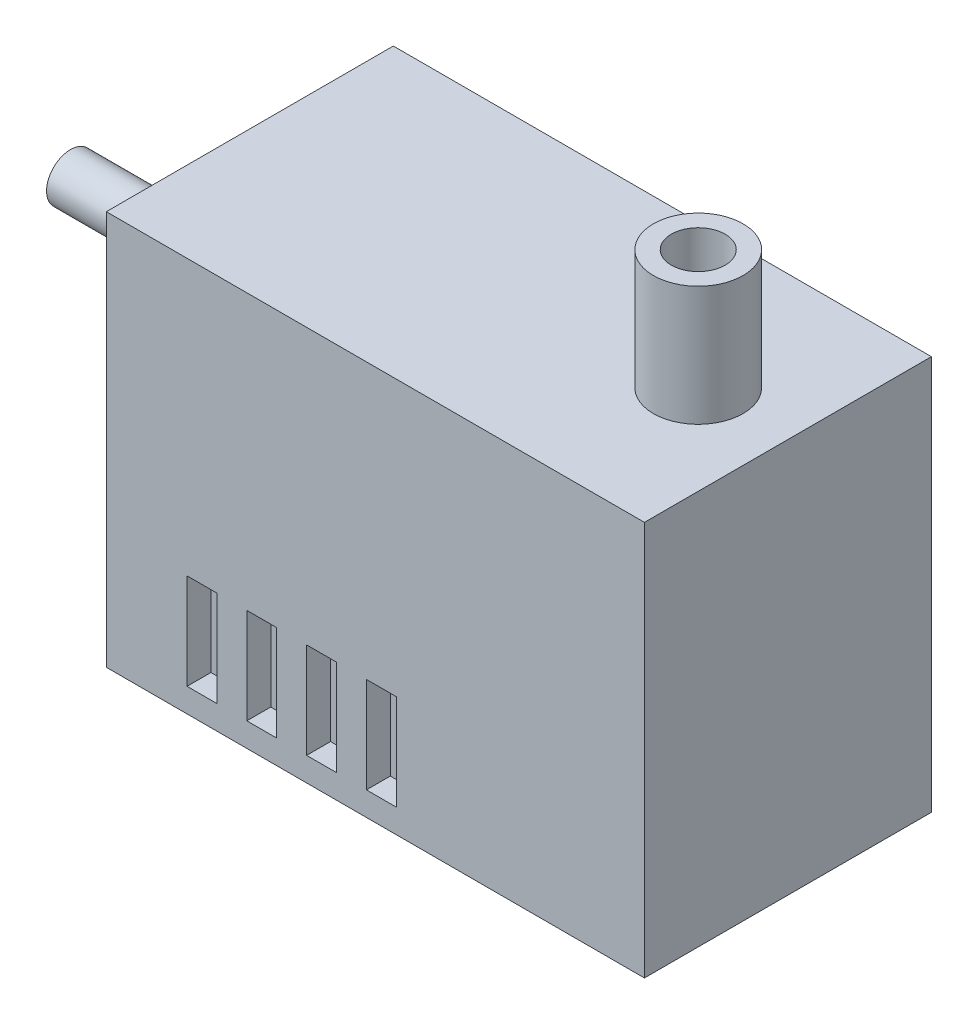
ISO-10303-21;
HEADER;
FILE_DESCRIPTION(('STEP AP214'),'2;1');
FILE_NAME('part.step','',(''),(''),'','','');
FILE_SCHEMA(('AUTOMOTIVE_DESIGN { 1 0 10303 214 1 1 1 1 }'));
ENDSEC;
DATA;
#1=APPLICATION_CONTEXT('core data for automotive mechanical design processes');
#2=APPLICATION_PROTOCOL_DEFINITION('international standard','automotive_design',2000,#1);
#3=PRODUCT_CONTEXT('',#1,'mechanical');
#4=PRODUCT('Part','Part','',(#3));
#5=PRODUCT_RELATED_PRODUCT_CATEGORY('part','',(#4));
#6=PRODUCT_DEFINITION_FORMATION('','',#4);
#7=PRODUCT_DEFINITION_CONTEXT('part definition',#1,'design');
#8=PRODUCT_DEFINITION('design','',#6,#7);
#9=PRODUCT_DEFINITION_SHAPE('','',#8);
#10=(LENGTH_UNIT() NAMED_UNIT(*) SI_UNIT(.MILLI.,.METRE.));
#11=(NAMED_UNIT(*) PLANE_ANGLE_UNIT() SI_UNIT($,.RADIAN.));
#12=(NAMED_UNIT(*) SI_UNIT($,.STERADIAN.) SOLID_ANGLE_UNIT());
#13=UNCERTAINTY_MEASURE_WITH_UNIT(LENGTH_MEASURE(1.E-05),#10,'distance_accuracy_value','');
#14=(GEOMETRIC_REPRESENTATION_CONTEXT(3) GLOBAL_UNCERTAINTY_ASSIGNED_CONTEXT((#13)) GLOBAL_UNIT_ASSIGNED_CONTEXT((#10,
#11,#12)) REPRESENTATION_CONTEXT('',''));
#15=CARTESIAN_POINT('',(0.,0.,0.));
#16=DIRECTION('',(0.,0.,1.));
#17=DIRECTION('',(1.,0.,0.));
#18=AXIS2_PLACEMENT_3D('',#15,#16,#17);
#19=CARTESIAN_POINT('',(22.5,33.,12.));
#20=DIRECTION('',(-1.,0.,0.));
#21=DIRECTION('',(0.,0.,1.));
#22=AXIS2_PLACEMENT_3D('',#19,#20,#21);
#23=PLANE('',#22);
#24=DIRECTION('',(0.,0.,-1.));
#25=VECTOR('',#24,1.);
#26=CARTESIAN_POINT('',(22.5,0.,12.));
#27=LINE('',#26,#25);
#28=CARTESIAN_POINT('',(22.5,0.,12.));
#29=VERTEX_POINT('',#28);
#30=CARTESIAN_POINT('',(22.5,0.,-12.));
#31=VERTEX_POINT('',#30);
#32=EDGE_CURVE('E321',#29,#31,#27,.T.);
#33=ORIENTED_EDGE('',*,*,#32,.T.);
#34=DIRECTION('',(0.,-1.,0.));
#35=VECTOR('',#34,1.);
#36=CARTESIAN_POINT('',(22.5,33.,-12.));
#37=LINE('',#36,#35);
#38=CARTESIAN_POINT('',(22.5,33.,-12.));
#39=VERTEX_POINT('',#38);
#40=EDGE_CURVE('E46',#39,#31,#37,.T.);
#41=ORIENTED_EDGE('',*,*,#40,.F.);
#42=DIRECTION('',(0.,0.,-1.));
#43=VECTOR('',#42,1.);
#44=CARTESIAN_POINT('',(22.5,33.,12.));
#45=LINE('',#44,#43);
#46=CARTESIAN_POINT('',(22.5,33.,12.));
#47=VERTEX_POINT('',#46);
#48=EDGE_CURVE('E327',#47,#39,#45,.T.);
#49=ORIENTED_EDGE('',*,*,#48,.F.);
#50=DIRECTION('',(0.,-1.,0.));
#51=VECTOR('',#50,1.);
#52=CARTESIAN_POINT('',(22.5,33.,12.));
#53=LINE('',#52,#51);
#54=EDGE_CURVE('E337',#47,#29,#53,.T.);
#55=ORIENTED_EDGE('',*,*,#54,.T.);
#56=EDGE_LOOP('',(#33,#41,#49,#55));
#57=FACE_BOUND('',#56,.T.);
#58=ADVANCED_FACE('F43',(#57),#23,.F.);
#59=CARTESIAN_POINT('',(-22.5,33.,-12.));
#60=DIRECTION('',(0.,0.,1.));
#61=DIRECTION('',(1.,0.,0.));
#62=AXIS2_PLACEMENT_3D('',#59,#60,#61);
#63=PLANE('',#62);
#64=DIRECTION('',(-1.,0.,0.));
#65=VECTOR('',#64,1.);
#66=CARTESIAN_POINT('',(-22.5,0.,-12.));
#67=LINE('',#66,#65);
#68=CARTESIAN_POINT('',(-22.5,0.,-12.));
#69=VERTEX_POINT('',#68);
#70=EDGE_CURVE('E339',#31,#69,#67,.T.);
#71=ORIENTED_EDGE('',*,*,#70,.T.);
#72=DIRECTION('',(0.,-1.,0.));
#73=VECTOR('',#72,1.);
#74=CARTESIAN_POINT('',(-22.5,33.,-12.));
#75=LINE('',#74,#73);
#76=CARTESIAN_POINT('',(-22.5,33.,-12.));
#77=VERTEX_POINT('',#76);
#78=EDGE_CURVE('E349',#77,#69,#75,.T.);
#79=ORIENTED_EDGE('',*,*,#78,.F.);
#80=DIRECTION('',(-1.,0.,0.));
#81=VECTOR('',#80,1.);
#82=CARTESIAN_POINT('',(-22.5,33.,-12.));
#83=LINE('',#82,#81);
#84=EDGE_CURVE('E326',#39,#77,#83,.T.);
#85=ORIENTED_EDGE('',*,*,#84,.F.);
#86=ORIENTED_EDGE('',*,*,#40,.T.);
#87=EDGE_LOOP('',(#71,#79,#85,#86));
#88=FACE_BOUND('',#87,.T.);
#89=ADVANCED_FACE('F357',(#88),#63,.F.);
#90=CARTESIAN_POINT('',(-22.5,33.,12.));
#91=DIRECTION('',(1.,0.,0.));
#92=DIRECTION('',(0.,0.,-1.));
#93=AXIS2_PLACEMENT_3D('',#90,#91,#92);
#94=PLANE('',#93);
#95=CARTESIAN_POINT('',(-22.5,22.,0.));
#96=DIRECTION('',(1.,0.,0.));
#97=DIRECTION('',(0.,0.,-1.));
#98=AXIS2_PLACEMENT_3D('',#95,#96,#97);
#99=CIRCLE('',#98,2.);
#100=CARTESIAN_POINT('',(-22.5,22.,-2.));
#101=VERTEX_POINT('',#100);
#102=EDGE_CURVE('E294',#101,#101,#99,.T.);
#103=ORIENTED_EDGE('',*,*,#102,.T.);
#104=EDGE_LOOP('',(#103));
#105=FACE_BOUND('',#104,.T.);
#106=DIRECTION('',(0.,0.,1.));
#107=VECTOR('',#106,1.);
#108=CARTESIAN_POINT('',(-22.5,0.,12.));
#109=LINE('',#108,#107);
#110=CARTESIAN_POINT('',(-22.5,0.,12.));
#111=VERTEX_POINT('',#110);
#112=EDGE_CURVE('E342',#69,#111,#109,.T.);
#113=ORIENTED_EDGE('',*,*,#112,.T.);
#114=DIRECTION('',(0.,-1.,0.));
#115=VECTOR('',#114,1.);
#116=CARTESIAN_POINT('',(-22.5,33.,12.));
#117=LINE('',#116,#115);
#118=CARTESIAN_POINT('',(-22.5,33.,12.));
#119=VERTEX_POINT('',#118);
#120=EDGE_CURVE('E347',#119,#111,#117,.T.);
#121=ORIENTED_EDGE('',*,*,#120,.F.);
#122=DIRECTION('',(0.,0.,1.));
#123=VECTOR('',#122,1.);
#124=CARTESIAN_POINT('',(-22.5,33.,12.));
#125=LINE('',#124,#123);
#126=EDGE_CURVE('E335',#77,#119,#125,.T.);
#127=ORIENTED_EDGE('',*,*,#126,.F.);
#128=ORIENTED_EDGE('',*,*,#78,.T.);
#129=EDGE_LOOP('',(#113,#121,#127,#128));
#130=FACE_BOUND('',#129,.T.);
#131=ADVANCED_FACE('F366',(#105,#130),#94,.F.);
#132=CARTESIAN_POINT('',(-22.5,33.,12.));
#133=DIRECTION('',(0.,0.,-1.));
#134=DIRECTION('',(-1.,0.,0.));
#135=AXIS2_PLACEMENT_3D('',#132,#133,#134);
#136=PLANE('',#135);
#137=DIRECTION('',(1.,0.,0.));
#138=VECTOR('',#137,1.);
#139=CARTESIAN_POINT('',(-15.75,2.,12.));
#140=LINE('',#139,#138);
#141=CARTESIAN_POINT('',(-15.75,2.,12.));
#142=VERTEX_POINT('',#141);
#143=CARTESIAN_POINT('',(-13.25,2.,12.));
#144=VERTEX_POINT('',#143);
#145=EDGE_CURVE('E215',#142,#144,#140,.T.);
#146=ORIENTED_EDGE('',*,*,#145,.F.);
#147=DIRECTION('',(0.,-1.,0.));
#148=VECTOR('',#147,1.);
#149=CARTESIAN_POINT('',(-15.75,10.,12.));
#150=LINE('',#149,#148);
#151=CARTESIAN_POINT('',(-15.75,10.,12.));
#152=VERTEX_POINT('',#151);
#153=EDGE_CURVE('E59',#152,#142,#150,.T.);
#154=ORIENTED_EDGE('',*,*,#153,.F.);
#155=DIRECTION('',(-1.,0.,0.));
#156=VECTOR('',#155,1.);
#157=CARTESIAN_POINT('',(-13.25,10.,12.));
#158=LINE('',#157,#156);
#159=CARTESIAN_POINT('',(-13.25,10.,12.));
#160=VERTEX_POINT('',#159);
#161=EDGE_CURVE('E198',#160,#152,#158,.T.);
#162=ORIENTED_EDGE('',*,*,#161,.F.);
#163=DIRECTION('',(0.,1.,0.));
#164=VECTOR('',#163,1.);
#165=CARTESIAN_POINT('',(-13.25,2.,12.));
#166=LINE('',#165,#164);
#167=EDGE_CURVE('E204',#144,#160,#166,.T.);
#168=ORIENTED_EDGE('',*,*,#167,.F.);
#169=EDGE_LOOP('',(#146,#154,#162,#168));
#170=FACE_BOUND('',#169,.T.);
#171=DIRECTION('',(1.,0.,0.));
#172=VECTOR('',#171,1.);
#173=CARTESIAN_POINT('',(-10.75,2.,12.));
#174=LINE('',#173,#172);
#175=CARTESIAN_POINT('',(-10.75,2.,12.));
#176=VERTEX_POINT('',#175);
#177=CARTESIAN_POINT('',(-8.25,2.,12.));
#178=VERTEX_POINT('',#177);
#179=EDGE_CURVE('E237',#176,#178,#174,.T.);
#180=ORIENTED_EDGE('',*,*,#179,.F.);
#181=DIRECTION('',(0.,-1.,0.));
#182=VECTOR('',#181,1.);
#183=CARTESIAN_POINT('',(-10.75,10.,12.));
#184=LINE('',#183,#182);
#185=CARTESIAN_POINT('',(-10.75,10.,12.));
#186=VERTEX_POINT('',#185);
#187=EDGE_CURVE('E67',#186,#176,#184,.T.);
#188=ORIENTED_EDGE('',*,*,#187,.F.);
#189=DIRECTION('',(-1.,0.,0.));
#190=VECTOR('',#189,1.);
#191=CARTESIAN_POINT('',(-8.25,10.,12.));
#192=LINE('',#191,#190);
#193=CARTESIAN_POINT('',(-8.25,10.,12.));
#194=VERTEX_POINT('',#193);
#195=EDGE_CURVE('E235',#194,#186,#192,.T.);
#196=ORIENTED_EDGE('',*,*,#195,.F.);
#197=DIRECTION('',(0.,1.,0.));
#198=VECTOR('',#197,1.);
#199=CARTESIAN_POINT('',(-8.25,2.,12.));
#200=LINE('',#199,#198);
#201=EDGE_CURVE('E232',#178,#194,#200,.T.);
#202=ORIENTED_EDGE('',*,*,#201,.F.);
#203=EDGE_LOOP('',(#180,#188,#196,#202));
#204=FACE_BOUND('',#203,.T.);
#205=DIRECTION('',(1.,0.,0.));
#206=VECTOR('',#205,1.);
#207=CARTESIAN_POINT('',(-5.75,2.,12.));
#208=LINE('',#207,#206);
#209=CARTESIAN_POINT('',(-5.75,2.,12.));
#210=VERTEX_POINT('',#209);
#211=CARTESIAN_POINT('',(-3.25,2.,12.));
#212=VERTEX_POINT('',#211);
#213=EDGE_CURVE('E272',#210,#212,#208,.T.);
#214=ORIENTED_EDGE('',*,*,#213,.F.);
#215=DIRECTION('',(0.,-1.,0.));
#216=VECTOR('',#215,1.);
#217=CARTESIAN_POINT('',(-5.75,10.,12.));
#218=LINE('',#217,#216);
#219=CARTESIAN_POINT('',(-5.75,10.,12.));
#220=VERTEX_POINT('',#219);
#221=EDGE_CURVE('E233',#220,#210,#218,.T.);
#222=ORIENTED_EDGE('',*,*,#221,.F.);
#223=DIRECTION('',(-1.,0.,0.));
#224=VECTOR('',#223,1.);
#225=CARTESIAN_POINT('',(-3.25,10.,12.));
#226=LINE('',#225,#224);
#227=CARTESIAN_POINT('',(-3.25,10.,12.));
#228=VERTEX_POINT('',#227);
#229=EDGE_CURVE('E261',#228,#220,#226,.T.);
#230=ORIENTED_EDGE('',*,*,#229,.F.);
#231=DIRECTION('',(0.,1.,0.));
#232=VECTOR('',#231,1.);
#233=CARTESIAN_POINT('',(-3.25,2.,12.));
#234=LINE('',#233,#232);
#235=EDGE_CURVE('E270',#212,#228,#234,.T.);
#236=ORIENTED_EDGE('',*,*,#235,.F.);
#237=EDGE_LOOP('',(#214,#222,#230,#236));
#238=FACE_BOUND('',#237,.T.);
#239=DIRECTION('',(1.,0.,0.));
#240=VECTOR('',#239,1.);
#241=CARTESIAN_POINT('',(-0.75,2.,12.));
#242=LINE('',#241,#240);
#243=CARTESIAN_POINT('',(-0.749999999999997,2.,12.));
#244=VERTEX_POINT('',#243);
#245=CARTESIAN_POINT('',(1.75,2.,12.));
#246=VERTEX_POINT('',#245);
#247=EDGE_CURVE('E303',#244,#246,#242,.T.);
#248=ORIENTED_EDGE('',*,*,#247,.F.);
#249=DIRECTION('',(0.,-1.,0.));
#250=VECTOR('',#249,1.);
#251=CARTESIAN_POINT('',(-0.75,10.,12.));
#252=LINE('',#251,#250);
#253=CARTESIAN_POINT('',(-0.75,10.,12.));
#254=VERTEX_POINT('',#253);
#255=EDGE_CURVE('E264',#254,#244,#252,.T.);
#256=ORIENTED_EDGE('',*,*,#255,.F.);
#257=DIRECTION('',(-1.,0.,0.));
#258=VECTOR('',#257,1.);
#259=CARTESIAN_POINT('',(1.75,10.,12.));
#260=LINE('',#259,#258);
#261=CARTESIAN_POINT('',(1.75,10.,12.));
#262=VERTEX_POINT('',#261);
#263=EDGE_CURVE('E298',#262,#254,#260,.T.);
#264=ORIENTED_EDGE('',*,*,#263,.F.);
#265=DIRECTION('',(0.,1.,0.));
#266=VECTOR('',#265,1.);
#267=CARTESIAN_POINT('',(1.75,2.,12.));
#268=LINE('',#267,#266);
#269=EDGE_CURVE('E299',#246,#262,#268,.T.);
#270=ORIENTED_EDGE('',*,*,#269,.F.);
#271=EDGE_LOOP('',(#248,#256,#264,#270));
#272=FACE_BOUND('',#271,.T.);
#273=DIRECTION('',(1.,0.,0.));
#274=VECTOR('',#273,1.);
#275=CARTESIAN_POINT('',(-22.5,0.,12.));
#276=LINE('',#275,#274);
#277=EDGE_CURVE('E328',#111,#29,#276,.T.);
#278=ORIENTED_EDGE('',*,*,#277,.T.);
#279=ORIENTED_EDGE('',*,*,#54,.F.);
#280=DIRECTION('',(1.,0.,0.));
#281=VECTOR('',#280,1.);
#282=CARTESIAN_POINT('',(-22.5,33.,12.));
#283=LINE('',#282,#281);
#284=EDGE_CURVE('E331',#119,#47,#283,.T.);
#285=ORIENTED_EDGE('',*,*,#284,.F.);
#286=ORIENTED_EDGE('',*,*,#120,.T.);
#287=EDGE_LOOP('',(#278,#279,#285,#286));
#288=FACE_BOUND('',#287,.T.);
#289=ADVANCED_FACE('F367',(#170,#204,#238,#272,#288),#136,.F.);
#290=CARTESIAN_POINT('',(0.,33.,0.));
#291=DIRECTION('',(0.,-1.,0.));
#292=DIRECTION('',(0.,0.,-1.));
#293=AXIS2_PLACEMENT_3D('',#290,#291,#292);
#294=PLANE('',#293);
#295=CARTESIAN_POINT('',(15.,33.,0.));
#296=DIRECTION('',(0.,1.,0.));
#297=DIRECTION('',(0.,0.,1.));
#298=AXIS2_PLACEMENT_3D('',#295,#296,#297);
#299=CIRCLE('',#298,3.75);
#300=CARTESIAN_POINT('',(15.,33.,3.75));
#301=VERTEX_POINT('',#300);
#302=EDGE_CURVE('E11',#301,#301,#299,.T.);
#303=ORIENTED_EDGE('',*,*,#302,.F.);
#304=EDGE_LOOP('',(#303));
#305=FACE_BOUND('',#304,.T.);
#306=ORIENTED_EDGE('',*,*,#48,.T.);
#307=ORIENTED_EDGE('',*,*,#84,.T.);
#308=ORIENTED_EDGE('',*,*,#126,.T.);
#309=ORIENTED_EDGE('',*,*,#284,.T.);
#310=EDGE_LOOP('',(#306,#307,#308,#309));
#311=FACE_BOUND('',#310,.T.);
#312=ADVANCED_FACE('F371',(#305,#311),#294,.F.);
#313=CARTESIAN_POINT('',(0.,0.,0.));
#314=DIRECTION('',(0.,-1.,0.));
#315=DIRECTION('',(0.,0.,-1.));
#316=AXIS2_PLACEMENT_3D('',#313,#314,#315);
#317=PLANE('',#316);
#318=ORIENTED_EDGE('',*,*,#32,.F.);
#319=ORIENTED_EDGE('',*,*,#277,.F.);
#320=ORIENTED_EDGE('',*,*,#112,.F.);
#321=ORIENTED_EDGE('',*,*,#70,.F.);
#322=EDGE_LOOP('',(#318,#319,#320,#321));
#323=FACE_BOUND('',#322,.T.);
#324=ADVANCED_FACE('F364',(#323),#317,.T.);
#325=CARTESIAN_POINT('',(15.,43.,0.));
#326=DIRECTION('',(0.,-1.,0.));
#327=DIRECTION('',(0.,0.,-1.));
#328=AXIS2_PLACEMENT_3D('',#325,#326,#327);
#329=CYLINDRICAL_SURFACE('',#328,3.75);
#330=CARTESIAN_POINT('',(15.,43.,0.));
#331=DIRECTION('',(0.,1.,0.));
#332=DIRECTION('',(0.,0.,1.));
#333=AXIS2_PLACEMENT_3D('',#330,#331,#332);
#334=CIRCLE('',#333,3.75);
#335=CARTESIAN_POINT('',(15.,43.,3.75));
#336=VERTEX_POINT('',#335);
#337=EDGE_CURVE('E318',#336,#336,#334,.T.);
#338=ORIENTED_EDGE('',*,*,#337,.F.);
#339=EDGE_LOOP('',(#338));
#340=FACE_BOUND('',#339,.T.);
#341=ORIENTED_EDGE('',*,*,#302,.T.);
#342=EDGE_LOOP('',(#341));
#343=FACE_BOUND('',#342,.T.);
#344=ADVANCED_FACE('F378',(#340,#343),#329,.T.);
#345=CARTESIAN_POINT('',(15.,43.,0.));
#346=DIRECTION('',(0.,1.,0.));
#347=DIRECTION('',(0.,0.,1.));
#348=AXIS2_PLACEMENT_3D('',#345,#346,#347);
#349=PLANE('',#348);
#350=CARTESIAN_POINT('',(15.,43.,0.));
#351=DIRECTION('',(0.,1.,0.));
#352=DIRECTION('',(0.,0.,1.));
#353=AXIS2_PLACEMENT_3D('',#350,#351,#352);
#354=CIRCLE('',#353,2.25);
#355=CARTESIAN_POINT('',(15.,43.,2.25));
#356=VERTEX_POINT('',#355);
#357=EDGE_CURVE('E219',#356,#356,#354,.T.);
#358=ORIENTED_EDGE('',*,*,#357,.F.);
#359=EDGE_LOOP('',(#358));
#360=FACE_BOUND('',#359,.T.);
#361=ORIENTED_EDGE('',*,*,#337,.T.);
#362=EDGE_LOOP('',(#361));
#363=FACE_BOUND('',#362,.T.);
#364=ADVANCED_FACE('F491',(#360,#363),#349,.T.);
#365=CARTESIAN_POINT('',(15.,28.,0.));
#366=DIRECTION('',(0.,1.,0.));
#367=DIRECTION('',(0.,0.,1.));
#368=AXIS2_PLACEMENT_3D('',#365,#366,#367);
#369=CYLINDRICAL_SURFACE('',#368,2.25);
#370=CARTESIAN_POINT('',(15.,28.,0.));
#371=DIRECTION('',(0.,1.,0.));
#372=DIRECTION('',(0.,0.,1.));
#373=AXIS2_PLACEMENT_3D('',#370,#371,#372);
#374=CIRCLE('',#373,2.25);
#375=CARTESIAN_POINT('',(15.,28.,2.25));
#376=VERTEX_POINT('',#375);
#377=EDGE_CURVE('E320',#376,#376,#374,.T.);
#378=ORIENTED_EDGE('',*,*,#377,.F.);
#379=EDGE_LOOP('',(#378));
#380=FACE_BOUND('',#379,.T.);
#381=ORIENTED_EDGE('',*,*,#357,.T.);
#382=EDGE_LOOP('',(#381));
#383=FACE_BOUND('',#382,.T.);
#384=ADVANCED_FACE('F490',(#380,#383),#369,.F.);
#385=CARTESIAN_POINT('',(15.,28.,0.));
#386=DIRECTION('',(0.,1.,0.));
#387=DIRECTION('',(0.,0.,1.));
#388=AXIS2_PLACEMENT_3D('',#385,#386,#387);
#389=PLANE('',#388);
#390=ORIENTED_EDGE('',*,*,#377,.T.);
#391=EDGE_LOOP('',(#390));
#392=FACE_BOUND('',#391,.T.);
#393=ADVANCED_FACE('F472',(#392),#389,.T.);
#394=CARTESIAN_POINT('',(-0.75,10.,10.));
#395=DIRECTION('',(-1.,0.,0.));
#396=DIRECTION('',(0.,0.,1.));
#397=AXIS2_PLACEMENT_3D('',#394,#395,#396);
#398=PLANE('',#397);
#399=ORIENTED_EDGE('',*,*,#255,.T.);
#400=DIRECTION('',(0.,0.,1.));
#401=VECTOR('',#400,1.);
#402=CARTESIAN_POINT('',(-0.75,2.,10.));
#403=LINE('',#402,#401);
#404=CARTESIAN_POINT('',(-0.75,2.,10.));
#405=VERTEX_POINT('',#404);
#406=EDGE_CURVE('E283',#405,#244,#403,.T.);
#407=ORIENTED_EDGE('',*,*,#406,.F.);
#408=DIRECTION('',(0.,-1.,0.));
#409=VECTOR('',#408,1.);
#410=CARTESIAN_POINT('',(-0.75,10.,10.));
#411=LINE('',#410,#409);
#412=CARTESIAN_POINT('',(-0.75,10.,10.));
#413=VERTEX_POINT('',#412);
#414=EDGE_CURVE('E297',#413,#405,#411,.T.);
#415=ORIENTED_EDGE('',*,*,#414,.F.);
#416=DIRECTION('',(0.,0.,1.));
#417=VECTOR('',#416,1.);
#418=CARTESIAN_POINT('',(-0.75,10.,10.));
#419=LINE('',#418,#417);
#420=EDGE_CURVE('E291',#413,#254,#419,.T.);
#421=ORIENTED_EDGE('',*,*,#420,.T.);
#422=EDGE_LOOP('',(#399,#407,#415,#421));
#423=FACE_BOUND('',#422,.T.);
#424=ADVANCED_FACE('F470',(#423),#398,.F.);
#425=CARTESIAN_POINT('',(1.75,10.,10.));
#426=DIRECTION('',(0.,1.,0.));
#427=DIRECTION('',(0.,0.,1.));
#428=AXIS2_PLACEMENT_3D('',#425,#426,#427);
#429=PLANE('',#428);
#430=ORIENTED_EDGE('',*,*,#263,.T.);
#431=ORIENTED_EDGE('',*,*,#420,.F.);
#432=DIRECTION('',(-1.,0.,0.));
#433=VECTOR('',#432,1.);
#434=CARTESIAN_POINT('',(1.75,10.,10.));
#435=LINE('',#434,#433);
#436=CARTESIAN_POINT('',(1.75,10.,10.));
#437=VERTEX_POINT('',#436);
#438=EDGE_CURVE('E289',#437,#413,#435,.T.);
#439=ORIENTED_EDGE('',*,*,#438,.F.);
#440=DIRECTION('',(0.,0.,1.));
#441=VECTOR('',#440,1.);
#442=CARTESIAN_POINT('',(1.75,10.,10.));
#443=LINE('',#442,#441);
#444=EDGE_CURVE('E293',#437,#262,#443,.T.);
#445=ORIENTED_EDGE('',*,*,#444,.T.);
#446=EDGE_LOOP('',(#430,#431,#439,#445));
#447=FACE_BOUND('',#446,.T.);
#448=ADVANCED_FACE('F468',(#447),#429,.F.);
#449=CARTESIAN_POINT('',(1.75,2.,10.));
#450=DIRECTION('',(1.,0.,0.));
#451=DIRECTION('',(0.,0.,-1.));
#452=AXIS2_PLACEMENT_3D('',#449,#450,#451);
#453=PLANE('',#452);
#454=ORIENTED_EDGE('',*,*,#269,.T.);
#455=ORIENTED_EDGE('',*,*,#444,.F.);
#456=DIRECTION('',(0.,1.,0.));
#457=VECTOR('',#456,1.);
#458=CARTESIAN_POINT('',(1.75,2.,10.));
#459=LINE('',#458,#457);
#460=CARTESIAN_POINT('',(1.75,2.,10.));
#461=VERTEX_POINT('',#460);
#462=EDGE_CURVE('E307',#461,#437,#459,.T.);
#463=ORIENTED_EDGE('',*,*,#462,.F.);
#464=DIRECTION('',(0.,0.,1.));
#465=VECTOR('',#464,1.);
#466=CARTESIAN_POINT('',(1.75,2.,10.));
#467=LINE('',#466,#465);
#468=EDGE_CURVE('E286',#461,#246,#467,.T.);
#469=ORIENTED_EDGE('',*,*,#468,.T.);
#470=EDGE_LOOP('',(#454,#455,#463,#469));
#471=FACE_BOUND('',#470,.T.);
#472=ADVANCED_FACE('F477',(#471),#453,.F.);
#473=CARTESIAN_POINT('',(-0.75,2.,10.));
#474=DIRECTION('',(0.,-1.,0.));
#475=DIRECTION('',(0.,0.,-1.));
#476=AXIS2_PLACEMENT_3D('',#473,#474,#475);
#477=PLANE('',#476);
#478=ORIENTED_EDGE('',*,*,#247,.T.);
#479=ORIENTED_EDGE('',*,*,#468,.F.);
#480=DIRECTION('',(1.,0.,0.));
#481=VECTOR('',#480,1.);
#482=CARTESIAN_POINT('',(-0.75,2.,10.));
#483=LINE('',#482,#481);
#484=EDGE_CURVE('E315',#405,#461,#483,.T.);
#485=ORIENTED_EDGE('',*,*,#484,.F.);
#486=ORIENTED_EDGE('',*,*,#406,.T.);
#487=EDGE_LOOP('',(#478,#479,#485,#486));
#488=FACE_BOUND('',#487,.T.);
#489=ADVANCED_FACE('F474',(#488),#477,.F.);
#490=CARTESIAN_POINT('',(0.,0.,10.));
#491=DIRECTION('',(0.,0.,1.));
#492=DIRECTION('',(1.,0.,0.));
#493=AXIS2_PLACEMENT_3D('',#490,#491,#492);
#494=PLANE('',#493);
#495=ORIENTED_EDGE('',*,*,#414,.T.);
#496=ORIENTED_EDGE('',*,*,#484,.T.);
#497=ORIENTED_EDGE('',*,*,#462,.T.);
#498=ORIENTED_EDGE('',*,*,#438,.T.);
#499=EDGE_LOOP('',(#495,#496,#497,#498));
#500=FACE_BOUND('',#499,.T.);
#501=ADVANCED_FACE('F452',(#500),#494,.T.);
#502=CARTESIAN_POINT('',(-5.75,10.,10.));
#503=DIRECTION('',(-1.,0.,0.));
#504=DIRECTION('',(0.,0.,1.));
#505=AXIS2_PLACEMENT_3D('',#502,#503,#504);
#506=PLANE('',#505);
#507=ORIENTED_EDGE('',*,*,#221,.T.);
#508=DIRECTION('',(0.,0.,1.));
#509=VECTOR('',#508,1.);
#510=CARTESIAN_POINT('',(-5.75,2.,10.));
#511=LINE('',#510,#509);
#512=CARTESIAN_POINT('',(-5.75,2.,10.));
#513=VERTEX_POINT('',#512);
#514=EDGE_CURVE('E254',#513,#210,#511,.T.);
#515=ORIENTED_EDGE('',*,*,#514,.F.);
#516=DIRECTION('',(0.,-1.,0.));
#517=VECTOR('',#516,1.);
#518=CARTESIAN_POINT('',(-5.75,10.,10.));
#519=LINE('',#518,#517);
#520=CARTESIAN_POINT('',(-5.75,10.,10.));
#521=VERTEX_POINT('',#520);
#522=EDGE_CURVE('E269',#521,#513,#519,.T.);
#523=ORIENTED_EDGE('',*,*,#522,.F.);
#524=DIRECTION('',(0.,0.,1.));
#525=VECTOR('',#524,1.);
#526=CARTESIAN_POINT('',(-5.75,10.,10.));
#527=LINE('',#526,#525);
#528=EDGE_CURVE('E262',#521,#220,#527,.T.);
#529=ORIENTED_EDGE('',*,*,#528,.T.);
#530=EDGE_LOOP('',(#507,#515,#523,#529));
#531=FACE_BOUND('',#530,.T.);
#532=ADVANCED_FACE('F450',(#531),#506,.F.);
#533=CARTESIAN_POINT('',(-3.25,10.,10.));
#534=DIRECTION('',(0.,1.,0.));
#535=DIRECTION('',(0.,0.,1.));
#536=AXIS2_PLACEMENT_3D('',#533,#534,#535);
#537=PLANE('',#536);
#538=ORIENTED_EDGE('',*,*,#229,.T.);
#539=ORIENTED_EDGE('',*,*,#528,.F.);
#540=DIRECTION('',(-1.,0.,0.));
#541=VECTOR('',#540,1.);
#542=CARTESIAN_POINT('',(-3.25,10.,10.));
#543=LINE('',#542,#541);
#544=CARTESIAN_POINT('',(-3.25,10.,10.));
#545=VERTEX_POINT('',#544);
#546=EDGE_CURVE('E257',#545,#521,#543,.T.);
#547=ORIENTED_EDGE('',*,*,#546,.F.);
#548=DIRECTION('',(0.,0.,1.));
#549=VECTOR('',#548,1.);
#550=CARTESIAN_POINT('',(-3.25,10.,10.));
#551=LINE('',#550,#549);
#552=EDGE_CURVE('E256',#545,#228,#551,.T.);
#553=ORIENTED_EDGE('',*,*,#552,.T.);
#554=EDGE_LOOP('',(#538,#539,#547,#553));
#555=FACE_BOUND('',#554,.T.);
#556=ADVANCED_FACE('F448',(#555),#537,.F.);
#557=CARTESIAN_POINT('',(-3.25,2.,10.));
#558=DIRECTION('',(1.,0.,0.));
#559=DIRECTION('',(0.,0.,-1.));
#560=AXIS2_PLACEMENT_3D('',#557,#558,#559);
#561=PLANE('',#560);
#562=ORIENTED_EDGE('',*,*,#235,.T.);
#563=ORIENTED_EDGE('',*,*,#552,.F.);
#564=DIRECTION('',(0.,1.,0.));
#565=VECTOR('',#564,1.);
#566=CARTESIAN_POINT('',(-3.25,2.,10.));
#567=LINE('',#566,#565);
#568=CARTESIAN_POINT('',(-3.25,2.,10.));
#569=VERTEX_POINT('',#568);
#570=EDGE_CURVE('E280',#569,#545,#567,.T.);
#571=ORIENTED_EDGE('',*,*,#570,.F.);
#572=DIRECTION('',(0.,0.,1.));
#573=VECTOR('',#572,1.);
#574=CARTESIAN_POINT('',(-3.25,2.,10.));
#575=LINE('',#574,#573);
#576=EDGE_CURVE('E260',#569,#212,#575,.T.);
#577=ORIENTED_EDGE('',*,*,#576,.T.);
#578=EDGE_LOOP('',(#562,#563,#571,#577));
#579=FACE_BOUND('',#578,.T.);
#580=ADVANCED_FACE('F457',(#579),#561,.F.);
#581=CARTESIAN_POINT('',(-5.75,2.,10.));
#582=DIRECTION('',(0.,-1.,0.));
#583=DIRECTION('',(0.,0.,-1.));
#584=AXIS2_PLACEMENT_3D('',#581,#582,#583);
#585=PLANE('',#584);
#586=ORIENTED_EDGE('',*,*,#213,.T.);
#587=ORIENTED_EDGE('',*,*,#576,.F.);
#588=DIRECTION('',(1.,0.,0.));
#589=VECTOR('',#588,1.);
#590=CARTESIAN_POINT('',(-5.75,2.,10.));
#591=LINE('',#590,#589);
#592=EDGE_CURVE('E278',#513,#569,#591,.T.);
#593=ORIENTED_EDGE('',*,*,#592,.F.);
#594=ORIENTED_EDGE('',*,*,#514,.T.);
#595=EDGE_LOOP('',(#586,#587,#593,#594));
#596=FACE_BOUND('',#595,.T.);
#597=ADVANCED_FACE('F454',(#596),#585,.F.);
#598=CARTESIAN_POINT('',(0.,0.,10.));
#599=DIRECTION('',(0.,0.,1.));
#600=DIRECTION('',(1.,0.,0.));
#601=AXIS2_PLACEMENT_3D('',#598,#599,#600);
#602=PLANE('',#601);
#603=ORIENTED_EDGE('',*,*,#522,.T.);
#604=ORIENTED_EDGE('',*,*,#592,.T.);
#605=ORIENTED_EDGE('',*,*,#570,.T.);
#606=ORIENTED_EDGE('',*,*,#546,.T.);
#607=EDGE_LOOP('',(#603,#604,#605,#606));
#608=FACE_BOUND('',#607,.T.);
#609=ADVANCED_FACE('F435',(#608),#602,.T.);
#610=CARTESIAN_POINT('',(-10.75,10.,10.));
#611=DIRECTION('',(-1.,0.,0.));
#612=DIRECTION('',(0.,0.,1.));
#613=AXIS2_PLACEMENT_3D('',#610,#611,#612);
#614=PLANE('',#613);
#615=ORIENTED_EDGE('',*,*,#187,.T.);
#616=DIRECTION('',(0.,0.,1.));
#617=VECTOR('',#616,1.);
#618=CARTESIAN_POINT('',(-10.75,2.,10.));
#619=LINE('',#618,#617);
#620=CARTESIAN_POINT('',(-10.75,2.,10.));
#621=VERTEX_POINT('',#620);
#622=EDGE_CURVE('E225',#621,#176,#619,.T.);
#623=ORIENTED_EDGE('',*,*,#622,.F.);
#624=DIRECTION('',(0.,-1.,0.));
#625=VECTOR('',#624,1.);
#626=CARTESIAN_POINT('',(-10.75,10.,10.));
#627=LINE('',#626,#625);
#628=CARTESIAN_POINT('',(-10.75,10.,10.));
#629=VERTEX_POINT('',#628);
#630=EDGE_CURVE('E236',#629,#621,#627,.T.);
#631=ORIENTED_EDGE('',*,*,#630,.F.);
#632=DIRECTION('',(0.,0.,1.));
#633=VECTOR('',#632,1.);
#634=CARTESIAN_POINT('',(-10.75,10.,10.));
#635=LINE('',#634,#633);
#636=EDGE_CURVE('E230',#629,#186,#635,.T.);
#637=ORIENTED_EDGE('',*,*,#636,.T.);
#638=EDGE_LOOP('',(#615,#623,#631,#637));
#639=FACE_BOUND('',#638,.T.);
#640=ADVANCED_FACE('F426',(#639),#614,.F.);
#641=CARTESIAN_POINT('',(-8.25,10.,10.));
#642=DIRECTION('',(0.,1.,0.));
#643=DIRECTION('',(0.,0.,1.));
#644=AXIS2_PLACEMENT_3D('',#641,#642,#643);
#645=PLANE('',#644);
#646=ORIENTED_EDGE('',*,*,#195,.T.);
#647=ORIENTED_EDGE('',*,*,#636,.F.);
#648=DIRECTION('',(-1.,0.,0.));
#649=VECTOR('',#648,1.);
#650=CARTESIAN_POINT('',(-8.25,10.,10.));
#651=LINE('',#650,#649);
#652=CARTESIAN_POINT('',(-8.25,10.,10.));
#653=VERTEX_POINT('',#652);
#654=EDGE_CURVE('E221',#653,#629,#651,.T.);
#655=ORIENTED_EDGE('',*,*,#654,.F.);
#656=DIRECTION('',(0.,0.,1.));
#657=VECTOR('',#656,1.);
#658=CARTESIAN_POINT('',(-8.25,10.,10.));
#659=LINE('',#658,#657);
#660=EDGE_CURVE('E227',#653,#194,#659,.T.);
#661=ORIENTED_EDGE('',*,*,#660,.T.);
#662=EDGE_LOOP('',(#646,#647,#655,#661));
#663=FACE_BOUND('',#662,.T.);
#664=ADVANCED_FACE('F431',(#663),#645,.F.);
#665=CARTESIAN_POINT('',(-8.25,2.,10.));
#666=DIRECTION('',(1.,0.,0.));
#667=DIRECTION('',(0.,0.,-1.));
#668=AXIS2_PLACEMENT_3D('',#665,#666,#667);
#669=PLANE('',#668);
#670=ORIENTED_EDGE('',*,*,#201,.T.);
#671=ORIENTED_EDGE('',*,*,#660,.F.);
#672=DIRECTION('',(0.,1.,0.));
#673=VECTOR('',#672,1.);
#674=CARTESIAN_POINT('',(-8.25,2.,10.));
#675=LINE('',#674,#673);
#676=CARTESIAN_POINT('',(-8.25,2.,10.));
#677=VERTEX_POINT('',#676);
#678=EDGE_CURVE('E244',#677,#653,#675,.T.);
#679=ORIENTED_EDGE('',*,*,#678,.F.);
#680=DIRECTION('',(0.,0.,1.));
#681=VECTOR('',#680,1.);
#682=CARTESIAN_POINT('',(-8.25,2.,10.));
#683=LINE('',#682,#681);
#684=EDGE_CURVE('E223',#677,#178,#683,.T.);
#685=ORIENTED_EDGE('',*,*,#684,.T.);
#686=EDGE_LOOP('',(#670,#671,#679,#685));
#687=FACE_BOUND('',#686,.T.);
#688=ADVANCED_FACE('F436',(#687),#669,.F.);
#689=CARTESIAN_POINT('',(-10.75,2.,10.));
#690=DIRECTION('',(0.,-1.,0.));
#691=DIRECTION('',(0.,0.,-1.));
#692=AXIS2_PLACEMENT_3D('',#689,#690,#691);
#693=PLANE('',#692);
#694=ORIENTED_EDGE('',*,*,#179,.T.);
#695=ORIENTED_EDGE('',*,*,#684,.F.);
#696=DIRECTION('',(1.,0.,0.));
#697=VECTOR('',#696,1.);
#698=CARTESIAN_POINT('',(-10.75,2.,10.));
#699=LINE('',#698,#697);
#700=EDGE_CURVE('E247',#621,#677,#699,.T.);
#701=ORIENTED_EDGE('',*,*,#700,.F.);
#702=ORIENTED_EDGE('',*,*,#622,.T.);
#703=EDGE_LOOP('',(#694,#695,#701,#702));
#704=FACE_BOUND('',#703,.T.);
#705=ADVANCED_FACE('F433',(#704),#693,.F.);
#706=CARTESIAN_POINT('',(0.,0.,10.));
#707=DIRECTION('',(0.,0.,1.));
#708=DIRECTION('',(1.,0.,0.));
#709=AXIS2_PLACEMENT_3D('',#706,#707,#708);
#710=PLANE('',#709);
#711=ORIENTED_EDGE('',*,*,#630,.T.);
#712=ORIENTED_EDGE('',*,*,#700,.T.);
#713=ORIENTED_EDGE('',*,*,#678,.T.);
#714=ORIENTED_EDGE('',*,*,#654,.T.);
#715=EDGE_LOOP('',(#711,#712,#713,#714));
#716=FACE_BOUND('',#715,.T.);
#717=ADVANCED_FACE('F430',(#716),#710,.T.);
#718=CARTESIAN_POINT('',(-15.75,10.,10.));
#719=DIRECTION('',(-1.,0.,0.));
#720=DIRECTION('',(0.,0.,1.));
#721=AXIS2_PLACEMENT_3D('',#718,#719,#720);
#722=PLANE('',#721);
#723=ORIENTED_EDGE('',*,*,#153,.T.);
#724=DIRECTION('',(0.,0.,1.));
#725=VECTOR('',#724,1.);
#726=CARTESIAN_POINT('',(-15.75,2.,10.));
#727=LINE('',#726,#725);
#728=CARTESIAN_POINT('',(-15.75,2.,10.));
#729=VERTEX_POINT('',#728);
#730=EDGE_CURVE('E178',#729,#142,#727,.T.);
#731=ORIENTED_EDGE('',*,*,#730,.F.);
#732=DIRECTION('',(0.,-1.,0.));
#733=VECTOR('',#732,1.);
#734=CARTESIAN_POINT('',(-15.75,10.,10.));
#735=LINE('',#734,#733);
#736=CARTESIAN_POINT('',(-15.75,10.,10.));
#737=VERTEX_POINT('',#736);
#738=EDGE_CURVE('E185',#737,#729,#735,.T.);
#739=ORIENTED_EDGE('',*,*,#738,.F.);
#740=DIRECTION('',(0.,0.,1.));
#741=VECTOR('',#740,1.);
#742=CARTESIAN_POINT('',(-15.75,10.,10.));
#743=LINE('',#742,#741);
#744=EDGE_CURVE('E217',#737,#152,#743,.T.);
#745=ORIENTED_EDGE('',*,*,#744,.T.);
#746=EDGE_LOOP('',(#723,#731,#739,#745));
#747=FACE_BOUND('',#746,.T.);
#748=ADVANCED_FACE('F179',(#747),#722,.F.);
#749=CARTESIAN_POINT('',(-13.25,10.,10.));
#750=DIRECTION('',(0.,1.,0.));
#751=DIRECTION('',(0.,0.,1.));
#752=AXIS2_PLACEMENT_3D('',#749,#750,#751);
#753=PLANE('',#752);
#754=ORIENTED_EDGE('',*,*,#161,.T.);
#755=ORIENTED_EDGE('',*,*,#744,.F.);
#756=DIRECTION('',(-1.,0.,0.));
#757=VECTOR('',#756,1.);
#758=CARTESIAN_POINT('',(-13.25,10.,10.));
#759=LINE('',#758,#757);
#760=CARTESIAN_POINT('',(-13.25,10.,10.));
#761=VERTEX_POINT('',#760);
#762=EDGE_CURVE('E189',#761,#737,#759,.T.);
#763=ORIENTED_EDGE('',*,*,#762,.F.);
#764=DIRECTION('',(0.,0.,1.));
#765=VECTOR('',#764,1.);
#766=CARTESIAN_POINT('',(-13.25,10.,10.));
#767=LINE('',#766,#765);
#768=EDGE_CURVE('E216',#761,#160,#767,.T.);
#769=ORIENTED_EDGE('',*,*,#768,.T.);
#770=EDGE_LOOP('',(#754,#755,#763,#769));
#771=FACE_BOUND('',#770,.T.);
#772=ADVANCED_FACE('F413',(#771),#753,.F.);
#773=CARTESIAN_POINT('',(-13.25,2.,10.));
#774=DIRECTION('',(1.,0.,0.));
#775=DIRECTION('',(0.,0.,-1.));
#776=AXIS2_PLACEMENT_3D('',#773,#774,#775);
#777=PLANE('',#776);
#778=ORIENTED_EDGE('',*,*,#167,.T.);
#779=ORIENTED_EDGE('',*,*,#768,.F.);
#780=DIRECTION('',(0.,1.,0.));
#781=VECTOR('',#780,1.);
#782=CARTESIAN_POINT('',(-13.25,2.,10.));
#783=LINE('',#782,#781);
#784=CARTESIAN_POINT('',(-13.25,2.,10.));
#785=VERTEX_POINT('',#784);
#786=EDGE_CURVE('E197',#785,#761,#783,.T.);
#787=ORIENTED_EDGE('',*,*,#786,.F.);
#788=DIRECTION('',(0.,0.,1.));
#789=VECTOR('',#788,1.);
#790=CARTESIAN_POINT('',(-13.25,2.,10.));
#791=LINE('',#790,#789);
#792=EDGE_CURVE('E190',#785,#144,#791,.T.);
#793=ORIENTED_EDGE('',*,*,#792,.T.);
#794=EDGE_LOOP('',(#778,#779,#787,#793));
#795=FACE_BOUND('',#794,.T.);
#796=ADVANCED_FACE('F419',(#795),#777,.F.);
#797=CARTESIAN_POINT('',(-15.75,2.,10.));
#798=DIRECTION('',(0.,-1.,0.));
#799=DIRECTION('',(0.,0.,-1.));
#800=AXIS2_PLACEMENT_3D('',#797,#798,#799);
#801=PLANE('',#800);
#802=ORIENTED_EDGE('',*,*,#145,.T.);
#803=ORIENTED_EDGE('',*,*,#792,.F.);
#804=DIRECTION('',(1.,0.,0.));
#805=VECTOR('',#804,1.);
#806=CARTESIAN_POINT('',(-15.75,2.,10.));
#807=LINE('',#806,#805);
#808=EDGE_CURVE('E192',#729,#785,#807,.T.);
#809=ORIENTED_EDGE('',*,*,#808,.F.);
#810=ORIENTED_EDGE('',*,*,#730,.T.);
#811=EDGE_LOOP('',(#802,#803,#809,#810));
#812=FACE_BOUND('',#811,.T.);
#813=ADVANCED_FACE('F195',(#812),#801,.F.);
#814=CARTESIAN_POINT('',(0.,0.,10.));
#815=DIRECTION('',(0.,0.,1.));
#816=DIRECTION('',(1.,0.,0.));
#817=AXIS2_PLACEMENT_3D('',#814,#815,#816);
#818=PLANE('',#817);
#819=ORIENTED_EDGE('',*,*,#738,.T.);
#820=ORIENTED_EDGE('',*,*,#808,.T.);
#821=ORIENTED_EDGE('',*,*,#786,.T.);
#822=ORIENTED_EDGE('',*,*,#762,.T.);
#823=EDGE_LOOP('',(#819,#820,#821,#822));
#824=FACE_BOUND('',#823,.T.);
#825=ADVANCED_FACE('F199',(#824),#818,.T.);
#826=CARTESIAN_POINT('',(-22.5,22.,0.));
#827=DIRECTION('',(-1.,0.,0.));
#828=DIRECTION('',(0.,0.,1.));
#829=AXIS2_PLACEMENT_3D('',#826,#827,#828);
#830=CYLINDRICAL_SURFACE('',#829,2.);
#831=ORIENTED_EDGE('',*,*,#102,.F.);
#832=EDGE_LOOP('',(#831));
#833=FACE_BOUND('',#832,.T.);
#834=CARTESIAN_POINT('',(-37.5,22.,0.));
#835=DIRECTION('',(1.,0.,0.));
#836=DIRECTION('',(0.,0.,-1.));
#837=AXIS2_PLACEMENT_3D('',#834,#835,#836);
#838=CIRCLE('',#837,2.);
#839=CARTESIAN_POINT('',(-37.5,22.,-2.));
#840=VERTEX_POINT('',#839);
#841=EDGE_CURVE('E207',#840,#840,#838,.T.);
#842=ORIENTED_EDGE('',*,*,#841,.T.);
#843=EDGE_LOOP('',(#842));
#844=FACE_BOUND('',#843,.T.);
#845=ADVANCED_FACE('F403',(#833,#844),#830,.T.);
#846=CARTESIAN_POINT('',(-37.5,22.,0.));
#847=DIRECTION('',(1.,0.,0.));
#848=DIRECTION('',(0.,0.,-1.));
#849=AXIS2_PLACEMENT_3D('',#846,#847,#848);
#850=PLANE('',#849);
#851=ORIENTED_EDGE('',*,*,#841,.F.);
#852=EDGE_LOOP('',(#851));
#853=FACE_BOUND('',#852,.T.);
#854=ADVANCED_FACE('F410',(#853),#850,.F.);
#855=CLOSED_SHELL('',(#58,#89,#131,#289,#312,#324,#344,#364,#384,#393,#424,#448,#472,#489,#501,
#532,#556,#580,#597,#609,#640,#664,#688,#705,#717,#748,#772,#796,#813,#825,#845,#854));
#856=MANIFOLD_SOLID_BREP('B2',#855);
#857=ADVANCED_BREP_SHAPE_REPRESENTATION('',(#18,#856),#14);
#858=SHAPE_DEFINITION_REPRESENTATION(#9,#857);
ENDSEC;
END-ISO-10303-21;
